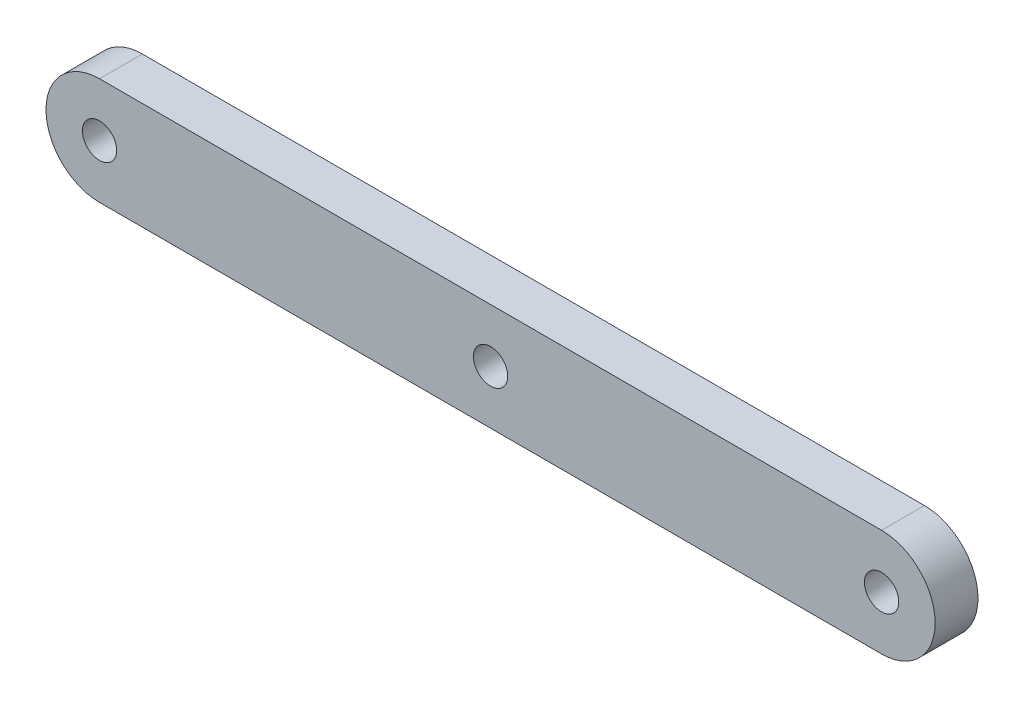
ISO-10303-21;
HEADER;
FILE_DESCRIPTION(('STEP AP214'),'2;1');
FILE_NAME('part.step','',(''),(''),'','','');
FILE_SCHEMA(('AUTOMOTIVE_DESIGN { 1 0 10303 214 1 1 1 1 }'));
ENDSEC;
DATA;
#1=APPLICATION_CONTEXT('core data for automotive mechanical design processes');
#2=APPLICATION_PROTOCOL_DEFINITION('international standard','automotive_design',2000,#1);
#3=PRODUCT_CONTEXT('',#1,'mechanical');
#4=PRODUCT('Part','Part','',(#3));
#5=PRODUCT_RELATED_PRODUCT_CATEGORY('part','',(#4));
#6=PRODUCT_DEFINITION_FORMATION('','',#4);
#7=PRODUCT_DEFINITION_CONTEXT('part definition',#1,'design');
#8=PRODUCT_DEFINITION('design','',#6,#7);
#9=PRODUCT_DEFINITION_SHAPE('','',#8);
#10=(LENGTH_UNIT() NAMED_UNIT(*) SI_UNIT(.MILLI.,.METRE.));
#11=(NAMED_UNIT(*) PLANE_ANGLE_UNIT() SI_UNIT($,.RADIAN.));
#12=(NAMED_UNIT(*) SI_UNIT($,.STERADIAN.) SOLID_ANGLE_UNIT());
#13=UNCERTAINTY_MEASURE_WITH_UNIT(LENGTH_MEASURE(1.E-05),#10,'distance_accuracy_value','');
#14=(GEOMETRIC_REPRESENTATION_CONTEXT(3) GLOBAL_UNCERTAINTY_ASSIGNED_CONTEXT((#13)) GLOBAL_UNIT_ASSIGNED_CONTEXT((#10,
#11,#12)) REPRESENTATION_CONTEXT('',''));
#15=CARTESIAN_POINT('',(0.,0.,0.));
#16=DIRECTION('',(0.,0.,1.));
#17=DIRECTION('',(1.,0.,0.));
#18=AXIS2_PLACEMENT_3D('',#15,#16,#17);
#19=CARTESIAN_POINT('',(-6.71338869192524,28.7207124677991,4.));
#20=DIRECTION('',(0.,0.,-1.));
#21=DIRECTION('',(-1.,0.,0.));
#22=AXIS2_PLACEMENT_3D('',#19,#20,#21);
#23=PLANE('',#22);
#24=CARTESIAN_POINT('',(-6.71338869192524,28.7207124677991,4.));
#25=DIRECTION('',(0.,0.,1.));
#26=DIRECTION('',(-1.,0.,0.));
#27=AXIS2_PLACEMENT_3D('',#24,#25,#26);
#28=CIRCLE('',#27,5.);
#29=CARTESIAN_POINT('',(-6.71338869192526,23.7207124677991,4.));
#30=VERTEX_POINT('',#29);
#31=CARTESIAN_POINT('',(-6.71338869192524,33.7207124677992,4.));
#32=VERTEX_POINT('',#31);
#33=EDGE_CURVE('E104',#30,#32,#28,.T.);
#34=ORIENTED_EDGE('',*,*,#33,.T.);
#35=DIRECTION('',(-1.,0.,0.));
#36=VECTOR('',#35,1.);
#37=CARTESIAN_POINT('',(-79.7133886919252,33.7207124677991,4.));
#38=LINE('',#37,#36);
#39=CARTESIAN_POINT('',(-79.7133886919252,33.7207124677991,4.));
#40=VERTEX_POINT('',#39);
#41=EDGE_CURVE('E97',#32,#40,#38,.T.);
#42=ORIENTED_EDGE('',*,*,#41,.T.);
#43=CARTESIAN_POINT('',(-79.7133886919252,28.7207124677991,4.));
#44=DIRECTION('',(0.,0.,1.));
#45=DIRECTION('',(1.,0.,0.));
#46=AXIS2_PLACEMENT_3D('',#43,#44,#45);
#47=CIRCLE('',#46,5.00000000000002);
#48=CARTESIAN_POINT('',(-79.7133886919252,23.7207124677991,4.));
#49=VERTEX_POINT('',#48);
#50=EDGE_CURVE('E102',#40,#49,#47,.T.);
#51=ORIENTED_EDGE('',*,*,#50,.T.);
#52=DIRECTION('',(1.,0.,0.));
#53=VECTOR('',#52,1.);
#54=CARTESIAN_POINT('',(-79.7133886919252,23.7207124677991,4.));
#55=LINE('',#54,#53);
#56=EDGE_CURVE('E66',#49,#30,#55,.T.);
#57=ORIENTED_EDGE('',*,*,#56,.T.);
#58=EDGE_LOOP('',(#34,#42,#51,#57));
#59=FACE_BOUND('',#58,.T.);
#60=CARTESIAN_POINT('',(-79.7133886919252,28.7207124677991,4.));
#61=DIRECTION('',(0.,0.,1.));
#62=DIRECTION('',(1.,0.,0.));
#63=AXIS2_PLACEMENT_3D('',#60,#61,#62);
#64=CIRCLE('',#63,1.6);
#65=CARTESIAN_POINT('',(-78.1133886919252,28.7207124677991,4.));
#66=VERTEX_POINT('',#65);
#67=EDGE_CURVE('E121',#66,#66,#64,.T.);
#68=ORIENTED_EDGE('',*,*,#67,.F.);
#69=EDGE_LOOP('',(#68));
#70=FACE_BOUND('',#69,.T.);
#71=CARTESIAN_POINT('',(-6.71338869192524,28.7207124677991,4.));
#72=DIRECTION('',(0.,0.,1.));
#73=DIRECTION('',(1.,0.,0.));
#74=AXIS2_PLACEMENT_3D('',#71,#72,#73);
#75=CIRCLE('',#74,1.6);
#76=CARTESIAN_POINT('',(-5.11338869192524,28.7207124677991,4.));
#77=VERTEX_POINT('',#76);
#78=EDGE_CURVE('E144',#77,#77,#75,.T.);
#79=ORIENTED_EDGE('',*,*,#78,.F.);
#80=EDGE_LOOP('',(#79));
#81=FACE_BOUND('',#80,.T.);
#82=CARTESIAN_POINT('',(-43.2133886919252,28.7207124677991,4.));
#83=DIRECTION('',(0.,0.,1.));
#84=DIRECTION('',(1.,0.,0.));
#85=AXIS2_PLACEMENT_3D('',#82,#83,#84);
#86=CIRCLE('',#85,1.6);
#87=CARTESIAN_POINT('',(-41.6133886919252,28.7207124677991,4.));
#88=VERTEX_POINT('',#87);
#89=EDGE_CURVE('E152',#88,#88,#86,.T.);
#90=ORIENTED_EDGE('',*,*,#89,.F.);
#91=EDGE_LOOP('',(#90));
#92=FACE_BOUND('',#91,.T.);
#93=ADVANCED_FACE('F49',(#59,#70,#81,#92),#23,.F.);
#94=CARTESIAN_POINT('',(-6.71338869192524,28.7207124677991,0.));
#95=DIRECTION('',(0.,0.,-1.));
#96=DIRECTION('',(-1.,0.,0.));
#97=AXIS2_PLACEMENT_3D('',#94,#95,#96);
#98=PLANE('',#97);
#99=CARTESIAN_POINT('',(-6.71338869192524,28.7207124677991,0.));
#100=DIRECTION('',(0.,0.,1.));
#101=DIRECTION('',(1.,0.,0.));
#102=AXIS2_PLACEMENT_3D('',#99,#100,#101);
#103=CIRCLE('',#102,1.6);
#104=CARTESIAN_POINT('',(-5.11338869192524,28.7207124677991,0.));
#105=VERTEX_POINT('',#104);
#106=EDGE_CURVE('E146',#105,#105,#103,.T.);
#107=ORIENTED_EDGE('',*,*,#106,.T.);
#108=EDGE_LOOP('',(#107));
#109=FACE_BOUND('',#108,.T.);
#110=CARTESIAN_POINT('',(-6.71338869192524,28.7207124677991,0.));
#111=DIRECTION('',(0.,0.,1.));
#112=DIRECTION('',(-1.,0.,0.));
#113=AXIS2_PLACEMENT_3D('',#110,#111,#112);
#114=CIRCLE('',#113,5.);
#115=CARTESIAN_POINT('',(-6.71338869192526,23.7207124677991,0.));
#116=VERTEX_POINT('',#115);
#117=CARTESIAN_POINT('',(-6.71338869192524,33.7207124677992,0.));
#118=VERTEX_POINT('',#117);
#119=EDGE_CURVE('E120',#116,#118,#114,.T.);
#120=ORIENTED_EDGE('',*,*,#119,.F.);
#121=DIRECTION('',(1.,0.,0.));
#122=VECTOR('',#121,1.);
#123=CARTESIAN_POINT('',(-79.7133886919252,23.7207124677991,0.));
#124=LINE('',#123,#122);
#125=CARTESIAN_POINT('',(-79.7133886919252,23.7207124677991,0.));
#126=VERTEX_POINT('',#125);
#127=EDGE_CURVE('E91',#126,#116,#124,.T.);
#128=ORIENTED_EDGE('',*,*,#127,.F.);
#129=CARTESIAN_POINT('',(-79.7133886919252,28.7207124677991,0.));
#130=DIRECTION('',(0.,0.,1.));
#131=DIRECTION('',(1.,0.,0.));
#132=AXIS2_PLACEMENT_3D('',#129,#130,#131);
#133=CIRCLE('',#132,5.00000000000002);
#134=CARTESIAN_POINT('',(-79.7133886919252,33.7207124677991,0.));
#135=VERTEX_POINT('',#134);
#136=EDGE_CURVE('E82',#135,#126,#133,.T.);
#137=ORIENTED_EDGE('',*,*,#136,.F.);
#138=DIRECTION('',(-1.,0.,0.));
#139=VECTOR('',#138,1.);
#140=CARTESIAN_POINT('',(-79.7133886919252,33.7207124677991,0.));
#141=LINE('',#140,#139);
#142=EDGE_CURVE('E107',#118,#135,#141,.T.);
#143=ORIENTED_EDGE('',*,*,#142,.F.);
#144=EDGE_LOOP('',(#120,#128,#137,#143));
#145=FACE_BOUND('',#144,.T.);
#146=CARTESIAN_POINT('',(-79.7133886919252,28.7207124677991,0.));
#147=DIRECTION('',(0.,0.,1.));
#148=DIRECTION('',(1.,0.,0.));
#149=AXIS2_PLACEMENT_3D('',#146,#147,#148);
#150=CIRCLE('',#149,1.6);
#151=CARTESIAN_POINT('',(-78.1133886919252,28.7207124677991,0.));
#152=VERTEX_POINT('',#151);
#153=EDGE_CURVE('E141',#152,#152,#150,.T.);
#154=ORIENTED_EDGE('',*,*,#153,.T.);
#155=EDGE_LOOP('',(#154));
#156=FACE_BOUND('',#155,.T.);
#157=CARTESIAN_POINT('',(-43.2133886919252,28.7207124677991,0.));
#158=DIRECTION('',(0.,0.,1.));
#159=DIRECTION('',(1.,0.,0.));
#160=AXIS2_PLACEMENT_3D('',#157,#158,#159);
#161=CIRCLE('',#160,1.6);
#162=CARTESIAN_POINT('',(-41.6133886919252,28.7207124677991,0.));
#163=VERTEX_POINT('',#162);
#164=EDGE_CURVE('E160',#163,#163,#161,.T.);
#165=ORIENTED_EDGE('',*,*,#164,.T.);
#166=EDGE_LOOP('',(#165));
#167=FACE_BOUND('',#166,.T.);
#168=ADVANCED_FACE('F136',(#109,#145,#156,#167),#98,.T.);
#169=CARTESIAN_POINT('',(-6.71338869192524,28.7207124677991,4.));
#170=DIRECTION('',(0.,0.,-1.));
#171=DIRECTION('',(-1.,0.,0.));
#172=AXIS2_PLACEMENT_3D('',#169,#170,#171);
#173=CYLINDRICAL_SURFACE('',#172,5.);
#174=ORIENTED_EDGE('',*,*,#119,.T.);
#175=DIRECTION('',(0.,0.,-1.));
#176=VECTOR('',#175,1.);
#177=CARTESIAN_POINT('',(-6.71338869192524,33.7207124677992,4.));
#178=LINE('',#177,#176);
#179=EDGE_CURVE('E12',#32,#118,#178,.T.);
#180=ORIENTED_EDGE('',*,*,#179,.F.);
#181=ORIENTED_EDGE('',*,*,#33,.F.);
#182=DIRECTION('',(0.,0.,-1.));
#183=VECTOR('',#182,1.);
#184=CARTESIAN_POINT('',(-6.71338869192526,23.7207124677991,4.));
#185=LINE('',#184,#183);
#186=EDGE_CURVE('E113',#30,#116,#185,.T.);
#187=ORIENTED_EDGE('',*,*,#186,.T.);
#188=EDGE_LOOP('',(#174,#180,#181,#187));
#189=FACE_BOUND('',#188,.T.);
#190=ADVANCED_FACE('F55',(#189),#173,.T.);
#191=CARTESIAN_POINT('',(-79.7133886919252,33.7207124677991,4.));
#192=DIRECTION('',(0.,-1.,0.));
#193=DIRECTION('',(1.,0.,0.));
#194=AXIS2_PLACEMENT_3D('',#191,#192,#193);
#195=PLANE('',#194);
#196=ORIENTED_EDGE('',*,*,#142,.T.);
#197=DIRECTION('',(0.,0.,-1.));
#198=VECTOR('',#197,1.);
#199=CARTESIAN_POINT('',(-79.7133886919252,33.7207124677991,4.));
#200=LINE('',#199,#198);
#201=EDGE_CURVE('E58',#40,#135,#200,.T.);
#202=ORIENTED_EDGE('',*,*,#201,.F.);
#203=ORIENTED_EDGE('',*,*,#41,.F.);
#204=ORIENTED_EDGE('',*,*,#179,.T.);
#205=EDGE_LOOP('',(#196,#202,#203,#204));
#206=FACE_BOUND('',#205,.T.);
#207=ADVANCED_FACE('F109',(#206),#195,.F.);
#208=CARTESIAN_POINT('',(-79.7133886919252,28.7207124677991,4.));
#209=DIRECTION('',(0.,0.,-1.));
#210=DIRECTION('',(-1.,0.,0.));
#211=AXIS2_PLACEMENT_3D('',#208,#209,#210);
#212=CYLINDRICAL_SURFACE('',#211,5.00000000000002);
#213=ORIENTED_EDGE('',*,*,#136,.T.);
#214=DIRECTION('',(0.,0.,-1.));
#215=VECTOR('',#214,1.);
#216=CARTESIAN_POINT('',(-79.7133886919252,23.7207124677991,4.));
#217=LINE('',#216,#215);
#218=EDGE_CURVE('E106',#49,#126,#217,.T.);
#219=ORIENTED_EDGE('',*,*,#218,.F.);
#220=ORIENTED_EDGE('',*,*,#50,.F.);
#221=ORIENTED_EDGE('',*,*,#201,.T.);
#222=EDGE_LOOP('',(#213,#219,#220,#221));
#223=FACE_BOUND('',#222,.T.);
#224=ADVANCED_FACE('F112',(#223),#212,.T.);
#225=CARTESIAN_POINT('',(-79.7133886919252,23.7207124677991,4.));
#226=DIRECTION('',(0.,1.,0.));
#227=DIRECTION('',(-1.,0.,0.));
#228=AXIS2_PLACEMENT_3D('',#225,#226,#227);
#229=PLANE('',#228);
#230=ORIENTED_EDGE('',*,*,#127,.T.);
#231=ORIENTED_EDGE('',*,*,#186,.F.);
#232=ORIENTED_EDGE('',*,*,#56,.F.);
#233=ORIENTED_EDGE('',*,*,#218,.T.);
#234=EDGE_LOOP('',(#230,#231,#232,#233));
#235=FACE_BOUND('',#234,.T.);
#236=ADVANCED_FACE('F133',(#235),#229,.F.);
#237=CARTESIAN_POINT('',(-79.7133886919252,28.7207124677991,4.));
#238=DIRECTION('',(0.,0.,-1.));
#239=DIRECTION('',(-1.,0.,0.));
#240=AXIS2_PLACEMENT_3D('',#237,#238,#239);
#241=CYLINDRICAL_SURFACE('',#240,1.6);
#242=ORIENTED_EDGE('',*,*,#67,.T.);
#243=EDGE_LOOP('',(#242));
#244=FACE_BOUND('',#243,.T.);
#245=ORIENTED_EDGE('',*,*,#153,.F.);
#246=EDGE_LOOP('',(#245));
#247=FACE_BOUND('',#246,.T.);
#248=ADVANCED_FACE('F176',(#244,#247),#241,.F.);
#249=CARTESIAN_POINT('',(-6.71338869192524,28.7207124677991,4.));
#250=DIRECTION('',(0.,0.,-1.));
#251=DIRECTION('',(-1.,0.,0.));
#252=AXIS2_PLACEMENT_3D('',#249,#250,#251);
#253=CYLINDRICAL_SURFACE('',#252,1.6);
#254=ORIENTED_EDGE('',*,*,#78,.T.);
#255=EDGE_LOOP('',(#254));
#256=FACE_BOUND('',#255,.T.);
#257=ORIENTED_EDGE('',*,*,#106,.F.);
#258=EDGE_LOOP('',(#257));
#259=FACE_BOUND('',#258,.T.);
#260=ADVANCED_FACE('F221',(#256,#259),#253,.F.);
#261=CARTESIAN_POINT('',(-43.2133886919252,28.7207124677991,4.));
#262=DIRECTION('',(0.,0.,-1.));
#263=DIRECTION('',(-1.,0.,0.));
#264=AXIS2_PLACEMENT_3D('',#261,#262,#263);
#265=CYLINDRICAL_SURFACE('',#264,1.6);
#266=ORIENTED_EDGE('',*,*,#89,.T.);
#267=EDGE_LOOP('',(#266));
#268=FACE_BOUND('',#267,.T.);
#269=ORIENTED_EDGE('',*,*,#164,.F.);
#270=EDGE_LOOP('',(#269));
#271=FACE_BOUND('',#270,.T.);
#272=ADVANCED_FACE('F161',(#268,#271),#265,.F.);
#273=CLOSED_SHELL('',(#93,#168,#190,#207,#224,#236,#248,#260,#272));
#274=MANIFOLD_SOLID_BREP('B2',#273);
#275=ADVANCED_BREP_SHAPE_REPRESENTATION('',(#18,#274),#14);
#276=SHAPE_DEFINITION_REPRESENTATION(#9,#275);
ENDSEC;
END-ISO-10303-21;
